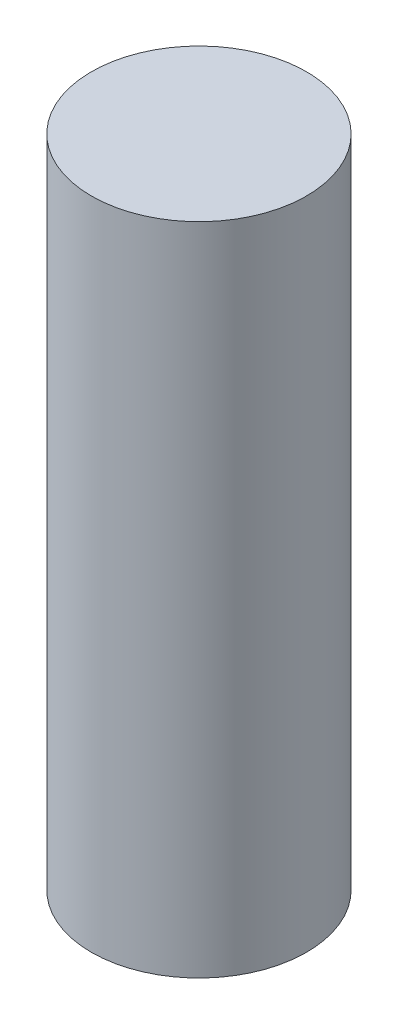
ISO-10303-21;
HEADER;
FILE_DESCRIPTION(('STEP AP214'),'2;1');
FILE_NAME('part.step','',(''),(''),'','','');
FILE_SCHEMA(('AUTOMOTIVE_DESIGN { 1 0 10303 214 1 1 1 1 }'));
ENDSEC;
DATA;
#1=APPLICATION_CONTEXT('core data for automotive mechanical design processes');
#2=APPLICATION_PROTOCOL_DEFINITION('international standard','automotive_design',2000,#1);
#3=PRODUCT_CONTEXT('',#1,'mechanical');
#4=PRODUCT('Part','Part','',(#3));
#5=PRODUCT_RELATED_PRODUCT_CATEGORY('part','',(#4));
#6=PRODUCT_DEFINITION_FORMATION('','',#4);
#7=PRODUCT_DEFINITION_CONTEXT('part definition',#1,'design');
#8=PRODUCT_DEFINITION('design','',#6,#7);
#9=PRODUCT_DEFINITION_SHAPE('','',#8);
#10=(LENGTH_UNIT() NAMED_UNIT(*) SI_UNIT(.MILLI.,.METRE.));
#11=(NAMED_UNIT(*) PLANE_ANGLE_UNIT() SI_UNIT($,.RADIAN.));
#12=(NAMED_UNIT(*) SI_UNIT($,.STERADIAN.) SOLID_ANGLE_UNIT());
#13=UNCERTAINTY_MEASURE_WITH_UNIT(LENGTH_MEASURE(1.E-05),#10,'distance_accuracy_value','');
#14=(GEOMETRIC_REPRESENTATION_CONTEXT(3) GLOBAL_UNCERTAINTY_ASSIGNED_CONTEXT((#13)) GLOBAL_UNIT_ASSIGNED_CONTEXT((#10,
#11,#12)) REPRESENTATION_CONTEXT('',''));
#15=CARTESIAN_POINT('',(0.,0.,0.));
#16=DIRECTION('',(0.,0.,1.));
#17=DIRECTION('',(1.,0.,0.));
#18=AXIS2_PLACEMENT_3D('',#15,#16,#17);
#19=CARTESIAN_POINT('',(0.,70.,0.));
#20=DIRECTION('',(0.,-1.,0.));
#21=DIRECTION('',(0.,0.,-1.));
#22=AXIS2_PLACEMENT_3D('',#19,#20,#21);
#23=CYLINDRICAL_SURFACE('',#22,11.5);
#24=CARTESIAN_POINT('',(0.,70.,0.));
#25=DIRECTION('',(0.,1.,0.));
#26=DIRECTION('',(0.,0.,1.));
#27=AXIS2_PLACEMENT_3D('',#24,#25,#26);
#28=CIRCLE('',#27,11.5);
#29=CARTESIAN_POINT('',(0.,70.,11.5));
#30=VERTEX_POINT('',#29);
#31=EDGE_CURVE('E10',#30,#30,#28,.T.);
#32=ORIENTED_EDGE('',*,*,#31,.F.);
#33=EDGE_LOOP('',(#32));
#34=FACE_BOUND('',#33,.T.);
#35=CARTESIAN_POINT('',(0.,0.,0.));
#36=DIRECTION('',(0.,1.,0.));
#37=DIRECTION('',(0.,0.,1.));
#38=AXIS2_PLACEMENT_3D('',#35,#36,#37);
#39=CIRCLE('',#38,11.5);
#40=CARTESIAN_POINT('',(0.,0.,11.5));
#41=VERTEX_POINT('',#40);
#42=EDGE_CURVE('E46',#41,#41,#39,.T.);
#43=ORIENTED_EDGE('',*,*,#42,.T.);
#44=EDGE_LOOP('',(#43));
#45=FACE_BOUND('',#44,.T.);
#46=ADVANCED_FACE('F43',(#34,#45),#23,.T.);
#47=CARTESIAN_POINT('',(0.,70.,0.));
#48=DIRECTION('',(0.,1.,0.));
#49=DIRECTION('',(0.,0.,1.));
#50=AXIS2_PLACEMENT_3D('',#47,#48,#49);
#51=PLANE('',#50);
#52=ORIENTED_EDGE('',*,*,#31,.T.);
#53=EDGE_LOOP('',(#52));
#54=FACE_BOUND('',#53,.T.);
#55=ADVANCED_FACE('F60',(#54),#51,.T.);
#56=CARTESIAN_POINT('',(0.,0.,0.));
#57=DIRECTION('',(0.,1.,0.));
#58=DIRECTION('',(0.,0.,1.));
#59=AXIS2_PLACEMENT_3D('',#56,#57,#58);
#60=PLANE('',#59);
#61=ORIENTED_EDGE('',*,*,#42,.F.);
#62=EDGE_LOOP('',(#61));
#63=FACE_BOUND('',#62,.T.);
#64=ADVANCED_FACE('F58',(#63),#60,.F.);
#65=CLOSED_SHELL('',(#46,#55,#64));
#66=MANIFOLD_SOLID_BREP('B2',#65);
#67=ADVANCED_BREP_SHAPE_REPRESENTATION('',(#18,#66),#14);
#68=SHAPE_DEFINITION_REPRESENTATION(#9,#67);
ENDSEC;
END-ISO-10303-21;
